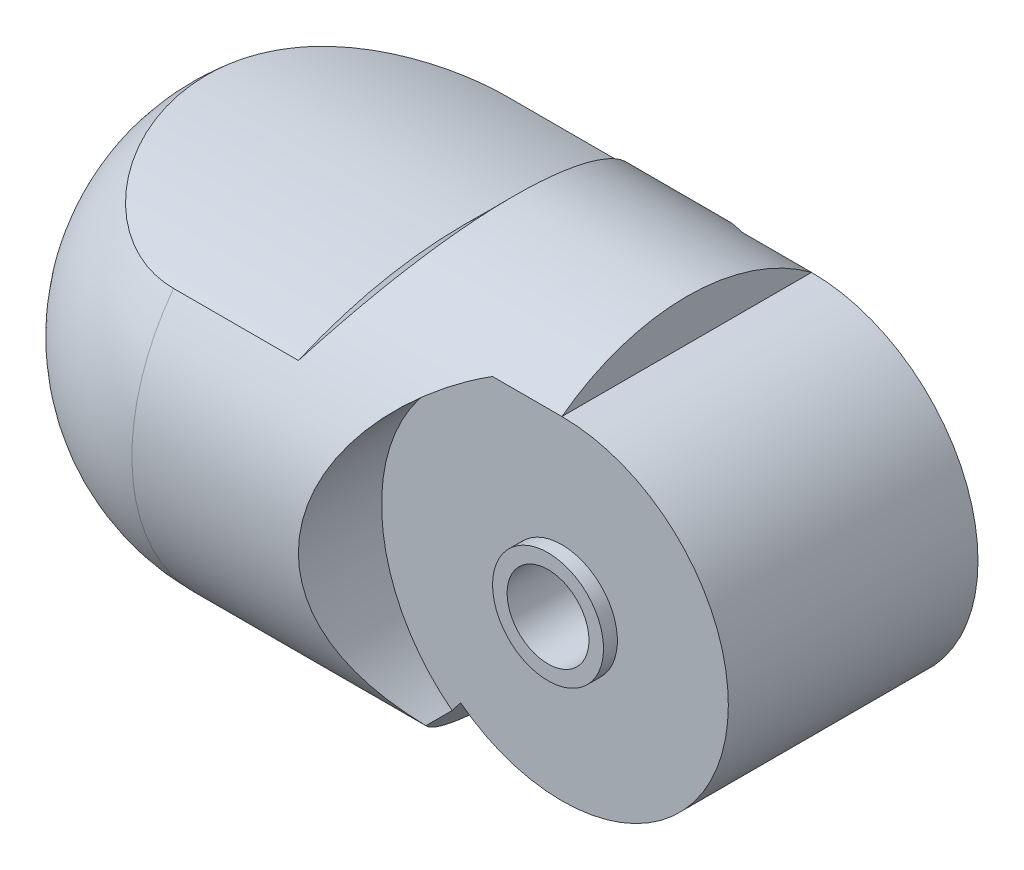
ISO-10303-21;
HEADER;
FILE_DESCRIPTION(('STEP AP214'),'2;1');
FILE_NAME('part.step','',(''),(''),'','','');
FILE_SCHEMA(('AUTOMOTIVE_DESIGN { 1 0 10303 214 1 1 1 1 }'));
ENDSEC;
DATA;
#1=APPLICATION_CONTEXT('core data for automotive mechanical design processes');
#2=APPLICATION_PROTOCOL_DEFINITION('international standard','automotive_design',2000,#1);
#3=PRODUCT_CONTEXT('',#1,'mechanical');
#4=PRODUCT('Part','Part','',(#3));
#5=PRODUCT_RELATED_PRODUCT_CATEGORY('part','',(#4));
#6=PRODUCT_DEFINITION_FORMATION('','',#4);
#7=PRODUCT_DEFINITION_CONTEXT('part definition',#1,'design');
#8=PRODUCT_DEFINITION('design','',#6,#7);
#9=PRODUCT_DEFINITION_SHAPE('','',#8);
#10=(LENGTH_UNIT() NAMED_UNIT(*) SI_UNIT(.MILLI.,.METRE.));
#11=(NAMED_UNIT(*) PLANE_ANGLE_UNIT() SI_UNIT($,.RADIAN.));
#12=(NAMED_UNIT(*) SI_UNIT($,.STERADIAN.) SOLID_ANGLE_UNIT());
#13=UNCERTAINTY_MEASURE_WITH_UNIT(LENGTH_MEASURE(1.E-05),#10,'distance_accuracy_value','');
#14=(GEOMETRIC_REPRESENTATION_CONTEXT(3) GLOBAL_UNCERTAINTY_ASSIGNED_CONTEXT((#13)) GLOBAL_UNIT_ASSIGNED_CONTEXT((#10,
#11,#12)) REPRESENTATION_CONTEXT('',''));
#15=CARTESIAN_POINT('',(0.,0.,0.));
#16=DIRECTION('',(0.,0.,1.));
#17=DIRECTION('',(1.,0.,0.));
#18=AXIS2_PLACEMENT_3D('',#15,#16,#17);
#19=CARTESIAN_POINT('',(-26.6251882186171,0.,0.));
#20=DIRECTION('',(-1.,0.,0.));
#21=DIRECTION('',(0.,-1.,0.));
#22=AXIS2_PLACEMENT_3D('',#19,#20,#21);
#23=CYLINDRICAL_SURFACE('',#22,7.5);
#24=CARTESIAN_POINT('',(-2.5,-6.,-4.5));
#25=CARTESIAN_POINT('',(-2.61366667061248,-5.95262055888465,-4.56319368112157));
#26=CARTESIAN_POINT('',(-2.72516759322645,-5.90238850187312,-4.62807084150607));
#27=CARTESIAN_POINT('',(-2.94400000796077,-5.79635239958535,-4.76019105031561));
#28=CARTESIAN_POINT('',(-3.0513326088171,-5.74054985030666,-4.82743346041018));
#29=CARTESIAN_POINT('',(-3.26215859740532,-5.62342079250245,-4.96338730551682));
#30=CARTESIAN_POINT('',(-3.36564795739226,-5.56208870749052,-5.03210016900114));
#31=CARTESIAN_POINT('',(-3.56876844482203,-5.43399555761649,-5.1701608964219));
#32=CARTESIAN_POINT('',(-3.66839927228238,-5.36723407189021,-5.23950880921422));
#33=CARTESIAN_POINT('',(-3.96339652129213,-5.15752976826969,-5.4487695626039));
#34=CARTESIAN_POINT('',(-4.15295241269161,-5.00623178756896,-5.5886377042216));
#35=CARTESIAN_POINT('',(-4.51583663692844,-4.68149738416788,-5.86334480848415));
#36=CARTESIAN_POINT('',(-4.68917628037558,-4.50807659440667,-5.99818723640243));
#37=CARTESIAN_POINT('',(-4.96228387540287,-4.2014787310822,-6.21449031567108));
#38=CARTESIAN_POINT('',(-5.06707570894892,-4.07458266842885,-6.29855414317088));
#39=CARTESIAN_POINT('',(-5.26815653702774,-3.81103553358688,-6.4614233482491));
#40=CARTESIAN_POINT('',(-5.36444665821888,-3.67438575832695,-6.54022942225285));
#41=CARTESIAN_POINT('',(-5.54728644214343,-3.39201935039931,-6.69101840958885));
#42=CARTESIAN_POINT('',(-5.63387151357495,-3.24633890440872,-6.76302596468398));
#43=CARTESIAN_POINT('',(-5.79667291056018,-2.94580564929915,-6.89923394469671));
#44=CARTESIAN_POINT('',(-5.87289098644523,-2.79095439490396,-6.96343568732871));
#45=CARTESIAN_POINT('',(-6.00088719448196,-2.50190946641496,-7.07175436638536));
#46=CARTESIAN_POINT('',(-6.0545841134301,-2.36913427355743,-7.11739553142938));
#47=CARTESIAN_POINT('',(-6.15365012836646,-2.09841725955915,-7.20185665934003));
#48=CARTESIAN_POINT('',(-6.199020893073,-1.96047648038669,-7.24067798896348));
#49=CARTESIAN_POINT('',(-6.28081706081565,-1.68007906025354,-7.31082898987929));
#50=CARTESIAN_POINT('',(-6.31724149000273,-1.53762192957159,-7.34215784557225));
#51=CARTESIAN_POINT('',(-6.38056734121297,-1.24906981618655,-7.39671419790833));
#52=CARTESIAN_POINT('',(-6.40746863649176,-1.10297478509397,-7.41994158672811));
#53=CARTESIAN_POINT('',(-6.4513861907253,-0.807484063054317,-7.45789923317722));
#54=CARTESIAN_POINT('',(-6.46835477254505,-0.658075968334065,-7.4725885054245));
#55=CARTESIAN_POINT('',(-6.49188983242892,-0.357827461747139,-7.49296996129368));
#56=CARTESIAN_POINT('',(-6.49845629627331,-0.206987047922763,-7.49866213261651));
#57=CARTESIAN_POINT('',(-6.5010598781167,0.0948298715604486,-7.5009185537971));
#58=CARTESIAN_POINT('',(-6.49709858537696,0.245806353239081,-7.49748418139021));
#59=CARTESIAN_POINT('',(-6.47872654463711,0.54663430412716,-7.48156911996084));
#60=CARTESIAN_POINT('',(-6.46431627786198,0.696485824825307,-7.46908884754512));
#61=CARTESIAN_POINT('',(-6.42686844173033,0.982054202030302,-7.43670340679829));
#62=CARTESIAN_POINT('',(-6.40460523515085,1.11794995148203,-7.4174651690957));
#63=CARTESIAN_POINT('',(-6.35178376424087,1.38695318027131,-7.37190467224366));
#64=CARTESIAN_POINT('',(-6.32122273210844,1.52005971325836,-7.34558004940246));
#65=CARTESIAN_POINT('',(-6.25224546498698,1.78265091716036,-7.2863064488754));
#66=CARTESIAN_POINT('',(-6.21383229378641,1.91213697839626,-7.2533600549904));
#67=CARTESIAN_POINT('',(-6.1296255575326,2.16696197731881,-7.18135337236267));
#68=CARTESIAN_POINT('',(-6.08382923655194,2.29229934527282,-7.1422908007759));
#69=CARTESIAN_POINT('',(-5.92884312993451,2.67949014470228,-7.01056690531066));
#70=CARTESIAN_POINT('',(-5.80718040487967,2.93307127107021,-6.90780964574216));
#71=CARTESIAN_POINT('',(-5.53702638274637,3.41586350982597,-6.68229806535853));
#72=CARTESIAN_POINT('',(-5.38850582175061,3.64504760249337,-6.55952194677225));
#73=CARTESIAN_POINT('',(-5.1077269274465,4.02524400009557,-6.3311872103849));
#74=CARTESIAN_POINT('',(-4.98028039114421,4.18172280013087,-6.22868963351702));
#75=CARTESIAN_POINT('',(-4.71373935570052,4.48003113026525,-6.01769835846473));
#76=CARTESIAN_POINT('',(-4.57464403771254,4.62185962895935,-5.90920423893827));
#77=CARTESIAN_POINT('',(-4.28564228596411,4.89104351904513,-5.6884107620547));
#78=CARTESIAN_POINT('',(-4.13572718038339,5.0183870857257,-5.57610839155439));
#79=CARTESIAN_POINT('',(-3.82572924486535,5.25853908861185,-5.35022623803666));
#80=CARTESIAN_POINT('',(-3.66565078501422,5.3713537096887,-5.23664702110163));
#81=CARTESIAN_POINT('',(-3.34302255508886,5.57755412796374,-5.01622928405569));
#82=CARTESIAN_POINT('',(-3.18094445079929,5.67160482759917,-4.90932527564958));
#83=CARTESIAN_POINT('',(-2.93085259782155,5.80249151427385,-4.75244344004898));
#84=CARTESIAN_POINT('',(-2.84647804328824,5.84435855380486,-4.70081479266893));
#85=CARTESIAN_POINT('',(-2.67517596620511,5.92472539490723,-4.59911332702261));
#86=CARTESIAN_POINT('',(-2.58824747093617,5.96322389069861,-4.54904111689938));
#87=CARTESIAN_POINT('',(-2.5,6.,-4.5));
#88=B_SPLINE_CURVE_WITH_KNOTS('',3,(#24,#25,#26,#27,#28,#29,#30,#31,#32,#33,#34,#35,#36,#37,#38,
#39,#40,#41,#42,#43,#44,#45,#46,#47,#48,#49,#50,#51,#52,#53,#54,#55,#56,#57,#58,#59,#60,#61,#62,
#63,#64,#65,#66,#67,#68,#69,#70,#71,#72,#73,#74,#75,#76,#77,#78,#79,#80,#81,#82,#83,#84,#85,#86,
#87),.UNSPECIFIED.,.F.,.F.,(4,2,2,2,2,2,2,2,2,2,2,2,2,2,2,2,2,2,2,2,2,2,2,2,2,2,2,2,2,2,2,4),
(0.,0.415135864992279,0.830160540540041,1.24560854930786,1.66108879259882,2.49960373279301,
3.33752939050435,3.89146392016444,4.44532493114681,4.99709446165422,5.54877071716296,
5.99929133607163,6.44972156330621,6.90020080019757,7.3506860323385,7.8033162335454,
8.25594705349888,8.70850954856689,9.16105120230198,9.57772293841711,9.99453382961873,
10.4111823967565,10.8279868490139,11.7227590587879,12.6185121391885,13.2967009311582,
13.9749374362249,14.6537237022159,15.332220051707,15.9787535245467,16.300908349358,
16.6231875058518),.UNSPECIFIED.);
#89=CARTESIAN_POINT('',(-3.95694928855665,-5.15679671189305,-5.44586519041824));
#90=VERTEX_POINT('',#89);
#91=CARTESIAN_POINT('',(-2.5,6.,-4.5));
#92=VERTEX_POINT('',#91);
#93=EDGE_CURVE('E115',#90,#92,#88,.T.);
#94=ORIENTED_EDGE('',*,*,#93,.F.);
#95=CARTESIAN_POINT('',(0.,0.,0.));
#96=DIRECTION('',(-0.793353340291238,0.608761429008716,0.));
#97=DIRECTION('',(-0.608761429008716,-0.793353340291239,0.));
#98=AXIS2_PLACEMENT_3D('',#95,#96,#97);
#99=ELLIPSE('',#98,9.45354310507695,7.5);
#100=CARTESIAN_POINT('',(-3.95694928855665,-5.15679671189305,5.44586519041824));
#101=VERTEX_POINT('',#100);
#102=EDGE_CURVE('E198',#101,#90,#99,.F.);
#103=ORIENTED_EDGE('',*,*,#102,.F.);
#104=CARTESIAN_POINT('',(-2.5,-6.,4.5));
#105=CARTESIAN_POINT('',(-2.61367522101961,-5.95261699088738,4.56319844444583));
#106=CARTESIAN_POINT('',(-2.72518437160695,-5.90238094023967,4.62808061085044));
#107=CARTESIAN_POINT('',(-2.94403263423304,-5.79633601977337,4.76021111439956));
#108=CARTESIAN_POINT('',(-3.05137285506923,-5.74052864603781,4.82745881319642));
#109=CARTESIAN_POINT('',(-3.26221366242599,-5.62338904407964,4.96342341331666));
#110=CARTESIAN_POINT('',(-3.36571021523305,-5.56205123108881,5.03214174510302));
#111=CARTESIAN_POINT('',(-3.56884451127557,-5.43394580190881,5.17021333902797));
#112=CARTESIAN_POINT('',(-3.66848195464748,-5.36717776502068,5.23956664999059));
#113=CARTESIAN_POINT('',(-3.96346857465463,-5.15747355467889,5.44882232451689));
#114=CARTESIAN_POINT('',(-4.15300863426054,-5.00618427872872,5.58867970324437));
#115=CARTESIAN_POINT('',(-4.51586309061732,-4.68147091278737,5.86336539213265));
#116=CARTESIAN_POINT('',(-4.68918883242538,-4.50806250327414,5.99819717832596));
#117=CARTESIAN_POINT('',(-4.96226219080438,-4.20150307470233,6.21447314091494));
#118=CARTESIAN_POINT('',(-5.06703389007009,-4.07463330422973,6.29852059718943));
#119=CARTESIAN_POINT('',(-5.26807866124039,-3.81114177232305,6.46135994500837));
#120=CARTESIAN_POINT('',(-5.36435280229892,-3.67452124164276,6.54015249741361));
#121=CARTESIAN_POINT('',(-5.54720140321441,-3.39216009771402,6.69094780167801));
#122=CARTESIAN_POINT('',(-5.63380750852531,-3.24645182720998,6.7629725755263));
#123=CARTESIAN_POINT('',(-5.79664479191743,-2.94586278159998,6.8992102585551));
#124=CARTESIAN_POINT('',(-5.87287797917142,-2.79098379117285,6.9634246802981));
#125=CARTESIAN_POINT('',(-6.0009332075686,-2.50180553959393,7.07179330517556));
#126=CARTESIAN_POINT('',(-6.05467000827909,-2.36892181732247,7.11746853803065));
#127=CARTESIAN_POINT('',(-6.15380197092644,-2.09798001017353,7.2019863422126));
#128=CARTESIAN_POINT('',(-6.19919880060703,-1.95992296646749,7.24083027952689));
#129=CARTESIAN_POINT('',(-6.28097417699106,-1.67948392098147,7.31096402736799));
#130=CARTESIAN_POINT('',(-6.31736435949611,-1.53710776904545,7.34226358319621));
#131=CARTESIAN_POINT('',(-6.38062065233832,-1.24878107355619,7.39676024339439));
#132=CARTESIAN_POINT('',(-6.40749027012771,-1.10283186757419,7.41996033162659));
#133=CARTESIAN_POINT('',(-6.45274600790494,-0.79833197820178,7.45907446372095));
#134=CARTESIAN_POINT('',(-6.4704323472663,-0.639598463539314,7.47438693407364));
#135=CARTESIAN_POINT('',(-6.49406018337431,-0.320575178956093,7.49485040713795));
#136=CARTESIAN_POINT('',(-6.49999964923658,-0.160285144745908,7.49999965275752));
#137=CARTESIAN_POINT('',(-6.50000033364919,0.152464609968258,7.50000033030004));
#138=CARTESIAN_POINT('',(-6.49462696888949,0.304924795959886,7.49534194856033));
#139=CARTESIAN_POINT('',(-6.4732367117178,0.608591249224011,7.47681515851016));
#140=CARTESIAN_POINT('',(-6.45721557705085,0.759796992383952,7.4629430793053));
#141=CARTESIAN_POINT('',(-6.41480725603112,1.0598261065879,7.42628026563808));
#142=CARTESIAN_POINT('',(-6.38840785052468,1.20864645336881,7.40347901828702));
#143=CARTESIAN_POINT('',(-6.32570681363501,1.50267947985689,7.34944312255976));
#144=CARTESIAN_POINT('',(-6.28940081246036,1.64789053659561,7.31820475263756));
#145=CARTESIAN_POINT('',(-6.20777395473506,1.93269936103721,7.24817356023754));
#146=CARTESIAN_POINT('',(-6.16251910820489,2.0723297279218,7.20943609542606));
#147=CARTESIAN_POINT('',(-6.06348031592944,2.34637348770517,7.12496524970025));
#148=CARTESIAN_POINT('',(-6.00969263500692,2.48078456367899,7.07922880535239));
#149=CARTESIAN_POINT('',(-5.83653843690031,2.87526626468125,6.93263082599652));
#150=CARTESIAN_POINT('',(-5.70531817210403,3.12679884369847,6.82232646953341));
#151=CARTESIAN_POINT('',(-5.46108401227987,3.53043059611895,6.61969374138968));
#152=CARTESIAN_POINT('',(-5.35488343220022,3.68931795831053,6.53227097396106));
#153=CARTESIAN_POINT('',(-5.13116816968434,3.99460823713841,6.350169718351));
#154=CARTESIAN_POINT('',(-5.01364953887934,4.14100676313852,6.25548870045324));
#155=CARTESIAN_POINT('',(-4.76820483770715,4.42143011154753,6.06054454878114));
#156=CARTESIAN_POINT('',(-4.64025653253738,4.55542712532428,5.96026964106493));
#157=CARTESIAN_POINT('',(-4.37497865755507,4.81076390776239,5.75614898984128));
#158=CARTESIAN_POINT('',(-4.23765009721239,4.93210503486512,5.6523036311686));
#159=CARTESIAN_POINT('',(-3.97540220932641,5.14492452434527,5.45868292304525));
#160=CARTESIAN_POINT('',(-3.85172180190743,5.2381497491077,5.36913977443785));
#161=CARTESIAN_POINT('',(-3.59801615175632,5.41555404117384,5.19014976634271));
#162=CARTESIAN_POINT('',(-3.46799224541517,5.49973500197725,5.10070289059667));
#163=CARTESIAN_POINT('',(-3.20226875178359,5.65856318933959,4.92388600611484));
#164=CARTESIAN_POINT('',(-3.06660754527622,5.73326417003545,4.83650680563881));
#165=CARTESIAN_POINT('',(-2.78848268180326,5.87354065753758,4.66518156088281));
#166=CARTESIAN_POINT('',(-2.64601611051737,5.93911220685187,4.58123701654736));
#167=CARTESIAN_POINT('',(-2.5,6.,4.5));
#168=B_SPLINE_CURVE_WITH_KNOTS('',3,(#104,#105,#106,#107,#108,#109,#110,#111,#112,#113,#114,
#115,#116,#117,#118,#119,#120,#121,#122,#123,#124,#125,#126,#127,#128,#129,#130,#131,#132,#133,
#134,#135,#136,#137,#138,#139,#140,#141,#142,#143,#144,#145,#146,#147,#148,#149,#150,#151,#152,
#153,#154,#155,#156,#157,#158,#159,#160,#161,#162,#163,#164,#165,#166,#167),.UNSPECIFIED.,.F.,
.F.,(4,2,2,2,2,2,2,2,2,2,2,2,2,2,2,2,2,2,2,2,2,2,2,2,2,2,2,2,2,2,2,4),(0.,0.415167094265802,
0.830223000905574,1.24570283823242,1.66121489499363,2.4996677598009,3.3375295063532,
3.89135356195819,4.44510783637,4.99699284422855,5.54877080259767,5.99965158251598,
6.45044210144477,6.90064716227692,7.35068619108759,7.8312780910662,8.31195307198487,
8.7691752531386,9.22657970877654,9.68452432330484,10.1426712642933,10.5975569806374,
11.0526423716779,11.9621335877428,12.5918969223417,13.2218807549321,13.8532446431907,
14.4845406930273,15.0209144027754,15.5571755980377,16.0902454964702,16.6235457591892),.UNSPECIFIED.);
#169=CARTESIAN_POINT('',(-2.5,6.,4.5));
#170=VERTEX_POINT('',#169);
#171=EDGE_CURVE('E170',#101,#170,#168,.T.);
#172=ORIENTED_EDGE('',*,*,#171,.T.);
#173=DIRECTION('',(-1.,0.,0.));
#174=VECTOR('',#173,1.);
#175=CARTESIAN_POINT('',(-26.6251882186171,6.,4.5));
#176=LINE('',#175,#174);
#177=CARTESIAN_POINT('',(0.,6.,4.5));
#178=VERTEX_POINT('',#177);
#179=EDGE_CURVE('E174',#170,#178,#176,.F.);
#180=ORIENTED_EDGE('',*,*,#179,.T.);
#181=CARTESIAN_POINT('',(0.,0.,0.));
#182=DIRECTION('',(-1.,0.,0.));
#183=DIRECTION('',(0.,-1.,0.));
#184=AXIS2_PLACEMENT_3D('',#181,#182,#183);
#185=CIRCLE('',#184,7.5);
#186=CARTESIAN_POINT('',(0.,6.,-4.5));
#187=VERTEX_POINT('',#186);
#188=EDGE_CURVE('E134',#178,#187,#185,.T.);
#189=ORIENTED_EDGE('',*,*,#188,.T.);
#190=DIRECTION('',(-1.,0.,0.));
#191=VECTOR('',#190,1.);
#192=CARTESIAN_POINT('',(-26.6251882186171,6.,-4.5));
#193=LINE('',#192,#191);
#194=EDGE_CURVE('E125',#92,#187,#193,.F.);
#195=ORIENTED_EDGE('',*,*,#194,.F.);
#196=EDGE_LOOP('',(#94,#103,#172,#180,#189,#195));
#197=FACE_BOUND('',#196,.T.);
#198=CARTESIAN_POINT('',(-12.5,0.,0.));
#199=DIRECTION('',(-1.,0.,0.));
#200=DIRECTION('',(0.,-1.,0.));
#201=AXIS2_PLACEMENT_3D('',#198,#199,#200);
#202=CIRCLE('',#201,7.5);
#203=CARTESIAN_POINT('',(-12.5,4.5,-6.));
#204=VERTEX_POINT('',#203);
#205=CARTESIAN_POINT('',(-12.5,4.5,6.));
#206=VERTEX_POINT('',#205);
#207=EDGE_CURVE('E195',#204,#206,#202,.T.);
#208=ORIENTED_EDGE('',*,*,#207,.F.);
#209=DIRECTION('',(1.,0.,0.));
#210=VECTOR('',#209,1.);
#211=CARTESIAN_POINT('',(-20.,4.5,-6.));
#212=LINE('',#211,#210);
#213=CARTESIAN_POINT('',(-8.00000000000004,4.5,-6.));
#214=VERTEX_POINT('',#213);
#215=EDGE_CURVE('E176',#204,#214,#212,.T.);
#216=ORIENTED_EDGE('',*,*,#215,.T.);
#217=CARTESIAN_POINT('',(-8.00000000000004,4.5,-6.));
#218=CARTESIAN_POINT('',(-7.90462281361367,4.65470037768084,-5.88399773688748));
#219=CARTESIAN_POINT('',(-7.81219526066145,4.80609880375609,-5.76107821624634));
#220=CARTESIAN_POINT('',(-7.63368841616847,5.10098960928757,-5.5016745160501));
#221=CARTESIAN_POINT('',(-7.54761306848754,5.24447706335078,-5.36518203092222));
#222=CARTESIAN_POINT('',(-7.38193297801115,5.52279796603769,-5.07827475923196));
#223=CARTESIAN_POINT('',(-7.30236561610647,5.65758059591276,-4.92778889069743));
#224=CARTESIAN_POINT('',(-7.15076788989482,5.9161541369522,-4.61415348692818));
#225=CARTESIAN_POINT('',(-7.07873597621666,6.03994730687494,-4.45100656700884));
#226=CARTESIAN_POINT('',(-6.9424280863894,6.2756227430557,-4.11209655560521));
#227=CARTESIAN_POINT('',(-6.87818658574533,6.38745182401709,-3.93628250832379));
#228=CARTESIAN_POINT('',(-6.75834812267142,6.59714580549484,-3.57372577401076));
#229=CARTESIAN_POINT('',(-6.70275036063513,6.69501199760735,-3.38698410006365));
#230=CARTESIAN_POINT('',(-6.6008559177083,6.87514239916047,-3.00448757813093));
#231=CARTESIAN_POINT('',(-6.5545285565267,6.95745802069553,-2.80876518745344));
#232=CARTESIAN_POINT('',(-6.47139883504046,7.10566350819068,-2.40933914866201));
#233=CARTESIAN_POINT('',(-6.43459266665583,7.17155994075227,-2.20563872907722));
#234=CARTESIAN_POINT('',(-6.36404391670424,7.29817549344354,-1.74769399382004));
#235=CARTESIAN_POINT('',(-6.33263069126811,7.35478985625956,-1.491938971975));
#236=CARTESIAN_POINT('',(-6.28483175126848,7.44106170301313,-0.97438960123838));
#237=CARTESIAN_POINT('',(-6.26845293949601,7.47070680442505,-0.712592534739189));
#238=CARTESIAN_POINT('',(-6.25347774863572,7.49781675062912,-0.26148936296499));
#239=CARTESIAN_POINT('',(-6.25115603592252,7.50202280719895,-0.0726770085563871));
#240=CARTESIAN_POINT('',(-6.25438090901204,7.49618230064462,0.304719108490814));
#241=CARTESIAN_POINT('',(-6.25992915202738,7.48613273564887,0.49330281461191));
#242=CARTESIAN_POINT('',(-6.27885846249224,7.45188674483738,0.868891747047117));
#243=CARTESIAN_POINT('',(-6.29224422131285,7.42768184594869,1.05589595984196));
#244=CARTESIAN_POINT('',(-6.32674106332078,7.36542119064468,1.42686511378018));
#245=CARTESIAN_POINT('',(-6.34785241121845,7.32736495962616,1.6108299505563));
#246=CARTESIAN_POINT('',(-6.39757733602606,7.23796046574324,1.97404039570457));
#247=CARTESIAN_POINT('',(-6.42617501155002,7.18664037896568,2.15329513103093));
#248=CARTESIAN_POINT('',(-6.4906719783472,7.07127357397338,2.50630675224607));
#249=CARTESIAN_POINT('',(-6.52657137565384,7.00722667094395,2.68006355825324));
#250=CARTESIAN_POINT('',(-6.60540374020179,6.86713483785824,3.02099710823956));
#251=CARTESIAN_POINT('',(-6.64833620884355,6.79109075833876,3.18817431762858));
#252=CARTESIAN_POINT('',(-6.74095250908429,6.62779208777641,3.51507736851775));
#253=CARTESIAN_POINT('',(-6.79063861232337,6.54053372525849,3.67480067845063));
#254=CARTESIAN_POINT('',(-6.89813740543756,6.35272542467053,3.99096103446995));
#255=CARTESIAN_POINT('',(-6.95616073365386,6.25183722533701,4.14712533355544));
#256=CARTESIAN_POINT('',(-7.07867647510121,6.04009686708339,4.44987159957897));
#257=CARTESIAN_POINT('',(-7.14316940018904,5.92924391985192,4.59645280681124));
#258=CARTESIAN_POINT('',(-7.27820573312618,5.69868691053789,4.8793703557296));
#259=CARTESIAN_POINT('',(-7.34874629551549,5.57898701462949,5.01571145942592));
#260=CARTESIAN_POINT('',(-7.49550548566534,5.33177025645502,5.27775130953556));
#261=CARTESIAN_POINT('',(-7.57172240602367,5.20425574678891,5.40345323201729));
#262=CARTESIAN_POINT('',(-7.70632231741607,4.98084629630909,5.60864968171442));
#263=CARTESIAN_POINT('',(-7.76337842951352,4.88664839361514,5.69088230082653));
#264=CARTESIAN_POINT('',(-7.87989384155583,4.69541134519173,5.84966063338628));
#265=CARTESIAN_POINT('',(-7.93934779283758,4.59837864316327,5.92621802838532));
#266=CARTESIAN_POINT('',(-8.00000000000004,4.5,6.));
#267=B_SPLINE_CURVE_WITH_KNOTS('',3,(#217,#218,#219,#220,#221,#222,#223,#224,#225,#226,#227,
#228,#229,#230,#231,#232,#233,#234,#235,#236,#237,#238,#239,#240,#241,#242,#243,#244,#245,#246,
#247,#248,#249,#250,#251,#252,#253,#254,#255,#256,#257,#258,#259,#260,#261,#262,#263,#264,#265,
#266),.UNSPECIFIED.,.F.,.F.,(4,2,2,2,2,2,2,2,2,2,2,2,2,2,2,2,2,2,2,2,2,2,2,2,4),(0.,
0.646731123311507,1.29386045871569,1.94447814144082,2.59496178598064,3.24822643798491,
3.90143062242196,4.55243591872879,5.20318043608798,5.99277476635689,6.78273144413987,
7.34869672691958,7.91478120529614,8.48120487677203,9.04764795806361,9.61289750895877,
10.1781552688244,10.743372972877,11.3087812651519,11.8924507052558,12.4761663601624,
13.0596088639803,13.6428765763696,14.0550497726622,14.4663495557302),.UNSPECIFIED.);
#268=CARTESIAN_POINT('',(-8.00000000000004,4.5,6.));
#269=VERTEX_POINT('',#268);
#270=EDGE_CURVE('E71',#214,#269,#267,.T.);
#271=ORIENTED_EDGE('',*,*,#270,.T.);
#272=DIRECTION('',(1.,0.,0.));
#273=VECTOR('',#272,1.);
#274=CARTESIAN_POINT('',(-20.,4.5,6.));
#275=LINE('',#274,#273);
#276=EDGE_CURVE('E172',#206,#269,#275,.T.);
#277=ORIENTED_EDGE('',*,*,#276,.F.);
#278=EDGE_LOOP('',(#208,#216,#271,#277));
#279=FACE_BOUND('',#278,.T.);
#280=ADVANCED_FACE('F47',(#197,#279),#23,.T.);
#281=CARTESIAN_POINT('',(-3.6525685740523,-4.76012004174743,-7.5));
#282=DIRECTION('',(-0.793353340291238,0.608761429008716,0.));
#283=DIRECTION('',(-0.608761429008716,-0.793353340291239,0.));
#284=AXIS2_PLACEMENT_3D('',#281,#282,#283);
#285=PLANE('',#284);
#286=ORIENTED_EDGE('',*,*,#102,.T.);
#287=DIRECTION('',(0.,0.,1.));
#288=VECTOR('',#287,1.);
#289=CARTESIAN_POINT('',(-3.95694928855665,-5.15679671189305,-7.5));
#290=LINE('',#289,#288);
#291=CARTESIAN_POINT('',(-3.95694928855665,-5.15679671189305,-4.5));
#292=VERTEX_POINT('',#291);
#293=EDGE_CURVE('E58',#90,#292,#290,.T.);
#294=ORIENTED_EDGE('',*,*,#293,.T.);
#295=DIRECTION('',(0.608761429008716,0.793353340291239,0.));
#296=VECTOR('',#295,1.);
#297=CARTESIAN_POINT('',(-3.6525685740523,-4.76012004174743,-4.5));
#298=LINE('',#297,#296);
#299=CARTESIAN_POINT('',(-3.6525685740523,-4.76012004174743,-4.5));
#300=VERTEX_POINT('',#299);
#301=EDGE_CURVE('E130',#292,#300,#298,.T.);
#302=ORIENTED_EDGE('',*,*,#301,.T.);
#303=DIRECTION('',(0.,0.,1.));
#304=VECTOR('',#303,1.);
#305=CARTESIAN_POINT('',(-3.6525685740523,-4.76012004174743,-7.5));
#306=LINE('',#305,#304);
#307=CARTESIAN_POINT('',(-3.6525685740523,-4.76012004174743,4.5));
#308=VERTEX_POINT('',#307);
#309=EDGE_CURVE('E183',#300,#308,#306,.T.);
#310=ORIENTED_EDGE('',*,*,#309,.T.);
#311=DIRECTION('',(0.608761429008716,0.793353340291239,0.));
#312=VECTOR('',#311,1.);
#313=CARTESIAN_POINT('',(-3.6525685740523,-4.76012004174743,4.5));
#314=LINE('',#313,#312);
#315=CARTESIAN_POINT('',(-3.95694928855665,-5.15679671189305,4.5));
#316=VERTEX_POINT('',#315);
#317=EDGE_CURVE('E239',#316,#308,#314,.T.);
#318=ORIENTED_EDGE('',*,*,#317,.F.);
#319=DIRECTION('',(0.,0.,-1.));
#320=VECTOR('',#319,1.);
#321=CARTESIAN_POINT('',(-3.95694928855665,-5.15679671189305,7.5));
#322=LINE('',#321,#320);
#323=EDGE_CURVE('E231',#101,#316,#322,.T.);
#324=ORIENTED_EDGE('',*,*,#323,.F.);
#325=EDGE_LOOP('',(#286,#294,#302,#310,#318,#324));
#326=FACE_BOUND('',#325,.T.);
#327=ADVANCED_FACE('F222',(#326),#285,.F.);
#328=CARTESIAN_POINT('',(0.,0.,4.5));
#329=DIRECTION('',(0.,0.,-1.));
#330=DIRECTION('',(-1.,0.,0.));
#331=AXIS2_PLACEMENT_3D('',#328,#329,#330);
#332=CYLINDRICAL_SURFACE('',#331,6.);
#333=ORIENTED_EDGE('',*,*,#309,.F.);
#334=CARTESIAN_POINT('',(0.,0.,-4.5));
#335=DIRECTION('',(0.,0.,1.));
#336=DIRECTION('',(1.,0.,0.));
#337=AXIS2_PLACEMENT_3D('',#334,#335,#336);
#338=CIRCLE('',#337,6.);
#339=EDGE_CURVE('E204',#300,#187,#338,.T.);
#340=ORIENTED_EDGE('',*,*,#339,.T.);
#341=DIRECTION('',(0.,0.,1.));
#342=VECTOR('',#341,1.);
#343=CARTESIAN_POINT('',(0.,6.,-7.5));
#344=LINE('',#343,#342);
#345=EDGE_CURVE('E179',#187,#178,#344,.T.);
#346=ORIENTED_EDGE('',*,*,#345,.T.);
#347=CARTESIAN_POINT('',(0.,0.,4.5));
#348=DIRECTION('',(0.,0.,1.));
#349=DIRECTION('',(1.,0.,0.));
#350=AXIS2_PLACEMENT_3D('',#347,#348,#349);
#351=CIRCLE('',#350,6.);
#352=EDGE_CURVE('E186',#308,#178,#351,.T.);
#353=ORIENTED_EDGE('',*,*,#352,.F.);
#354=EDGE_LOOP('',(#333,#340,#346,#353));
#355=FACE_BOUND('',#354,.T.);
#356=ADVANCED_FACE('F225',(#355),#332,.T.);
#357=CARTESIAN_POINT('',(0.,0.,4.5));
#358=DIRECTION('',(0.,0.,1.));
#359=DIRECTION('',(1.,0.,0.));
#360=AXIS2_PLACEMENT_3D('',#357,#358,#359);
#361=PLANE('',#360);
#362=CARTESIAN_POINT('',(0.,0.,4.5));
#363=DIRECTION('',(0.,0.,-1.));
#364=DIRECTION('',(-1.,0.,0.));
#365=AXIS2_PLACEMENT_3D('',#362,#363,#364);
#366=CIRCLE('',#365,2.);
#367=CARTESIAN_POINT('',(-2.,0.,4.5));
#368=VERTEX_POINT('',#367);
#369=EDGE_CURVE('E266',#368,#368,#366,.T.);
#370=ORIENTED_EDGE('',*,*,#369,.T.);
#371=EDGE_LOOP('',(#370));
#372=FACE_BOUND('',#371,.T.);
#373=ORIENTED_EDGE('',*,*,#352,.T.);
#374=ORIENTED_EDGE('',*,*,#179,.F.);
#375=CARTESIAN_POINT('',(0.,0.,4.5));
#376=DIRECTION('',(0.,0.,1.));
#377=DIRECTION('',(1.,0.,0.));
#378=AXIS2_PLACEMENT_3D('',#375,#376,#377);
#379=CIRCLE('',#378,6.5);
#380=EDGE_CURVE('E70',#170,#316,#379,.T.);
#381=ORIENTED_EDGE('',*,*,#380,.T.);
#382=ORIENTED_EDGE('',*,*,#317,.T.);
#383=EDGE_LOOP('',(#373,#374,#381,#382));
#384=FACE_BOUND('',#383,.T.);
#385=ADVANCED_FACE('F230',(#372,#384),#361,.T.);
#386=CARTESIAN_POINT('',(0.,0.,-4.5));
#387=DIRECTION('',(0.,0.,1.));
#388=DIRECTION('',(1.,0.,0.));
#389=AXIS2_PLACEMENT_3D('',#386,#387,#388);
#390=PLANE('',#389);
#391=CARTESIAN_POINT('',(0.,0.,-4.5));
#392=DIRECTION('',(0.,0.,1.));
#393=DIRECTION('',(1.,0.,0.));
#394=AXIS2_PLACEMENT_3D('',#391,#392,#393);
#395=CIRCLE('',#394,2.);
#396=CARTESIAN_POINT('',(2.,0.,-4.5));
#397=VERTEX_POINT('',#396);
#398=EDGE_CURVE('E11',#397,#397,#395,.F.);
#399=ORIENTED_EDGE('',*,*,#398,.F.);
#400=EDGE_LOOP('',(#399));
#401=FACE_BOUND('',#400,.T.);
#402=ORIENTED_EDGE('',*,*,#339,.F.);
#403=ORIENTED_EDGE('',*,*,#301,.F.);
#404=CARTESIAN_POINT('',(0.,0.,-4.5));
#405=DIRECTION('',(0.,0.,1.));
#406=DIRECTION('',(1.,0.,0.));
#407=AXIS2_PLACEMENT_3D('',#404,#405,#406);
#408=CIRCLE('',#407,6.5);
#409=EDGE_CURVE('E114',#92,#292,#408,.T.);
#410=ORIENTED_EDGE('',*,*,#409,.F.);
#411=ORIENTED_EDGE('',*,*,#194,.T.);
#412=EDGE_LOOP('',(#402,#403,#410,#411));
#413=FACE_BOUND('',#412,.T.);
#414=ADVANCED_FACE('F129',(#401,#413),#390,.F.);
#415=CARTESIAN_POINT('',(0.,0.,0.));
#416=DIRECTION('',(1.,0.,0.));
#417=DIRECTION('',(0.,1.,0.));
#418=AXIS2_PLACEMENT_3D('',#415,#416,#417);
#419=PLANE('',#418);
#420=ORIENTED_EDGE('',*,*,#345,.F.);
#421=ORIENTED_EDGE('',*,*,#188,.F.);
#422=EDGE_LOOP('',(#420,#421));
#423=FACE_BOUND('',#422,.T.);
#424=ADVANCED_FACE('F218',(#423),#419,.T.);
#425=CARTESIAN_POINT('',(-12.5,0.,0.));
#426=DIRECTION('',(-1.,0.,0.));
#427=DIRECTION('',(0.,1.,0.));
#428=AXIS2_PLACEMENT_3D('',#425,#426,#427);
#429=SPHERICAL_SURFACE('',#428,7.5);
#430=CARTESIAN_POINT('',(-12.4998,4.50000000216269,-5.99999999504466));
#431=CARTESIAN_POINT('',(-12.6255870807863,4.49996189065697,-6.00004562392007));
#432=CARTESIAN_POINT('',(-12.7513463654693,4.50255995539478,-5.99413356787414));
#433=CARTESIAN_POINT('',(-13.0014640864266,4.51276065385299,-5.97070119164442));
#434=CARTESIAN_POINT('',(-13.1258236776686,4.52035879811585,-5.95319128481483));
#435=CARTESIAN_POINT('',(-13.3708693141682,4.54019903889874,-5.90708708815846));
#436=CARTESIAN_POINT('',(-13.4915789053878,4.55239679998597,-5.87859856471982));
#437=CARTESIAN_POINT('',(-13.7294800561217,4.58096307478044,-5.81108211934314));
#438=CARTESIAN_POINT('',(-13.8466710653247,4.59733223714167,-5.7720525582145));
#439=CARTESIAN_POINT('',(-14.1908462739512,4.65174686088364,-5.64035845139919));
#440=CARTESIAN_POINT('',(-14.4114792648582,4.69519195799304,-5.53288445821469));
#441=CARTESIAN_POINT('',(-14.830814897854,4.79133456926281,-5.28417410808728));
#442=CARTESIAN_POINT('',(-15.0294611010074,4.84405503475214,-5.14285367930019));
#443=CARTESIAN_POINT('',(-15.4453459994383,4.9661885084267,-4.79640442678384));
#444=CARTESIAN_POINT('',(-15.6562773266649,5.03664403906322,-4.58407690938894));
#445=CARTESIAN_POINT('',(-16.0396343550452,5.17541684595394,-4.12675424849189));
#446=CARTESIAN_POINT('',(-16.2120354635939,5.24373273276202,-3.88173839947097));
#447=CARTESIAN_POINT('',(-16.5205003341981,5.37266734589988,-3.3639467448782));
#448=CARTESIAN_POINT('',(-16.656102218858,5.43318363731701,-3.09087255986724));
#449=CARTESIAN_POINT('',(-16.8889897439252,5.54077698994774,-2.52638580404564));
#450=CARTESIAN_POINT('',(-16.9862759826398,5.58785426101142,-2.23497351967085));
#451=CARTESIAN_POINT('',(-17.1105361915374,5.64920337331132,-1.76416002639168));
#452=CARTESIAN_POINT('',(-17.1499223512156,5.66897422377925,-1.58861426689425));
#453=CARTESIAN_POINT('',(-17.2160143969336,5.7024401345783,-1.23453367749533));
#454=CARTESIAN_POINT('',(-17.2427190848101,5.71613462079789,-1.05599856680481));
#455=CARTESIAN_POINT('',(-17.2835163132087,5.73714822459152,-0.697041998454035));
#456=CARTESIAN_POINT('',(-17.2976025867417,5.7444641741901,-0.516619648439835));
#457=CARTESIAN_POINT('',(-17.3131844436937,5.75256094602659,-0.155084186418221));
#458=CARTESIAN_POINT('',(-17.3146798054692,5.75334165322177,0.0260289376930439));
#459=CARTESIAN_POINT('',(-17.3047631895669,5.74818336976665,0.399861694173582));
#460=CARTESIAN_POINT('',(-17.2924869955835,5.74179444920076,0.59255293088115));
#461=CARTESIAN_POINT('',(-17.2535765743187,5.72171168703215,0.976108085996819));
#462=CARTESIAN_POINT('',(-17.2269414645824,5.70801739646435,1.16697189136279));
#463=CARTESIAN_POINT('',(-17.1592074968362,5.67364329474787,1.54559287174308));
#464=CARTESIAN_POINT('',(-17.1181006602298,5.65295963044935,1.73334827311456));
#465=CARTESIAN_POINT('',(-17.0212981824738,5.60512525998405,2.10421780386663));
#466=CARTESIAN_POINT('',(-16.9656031156862,5.57797480842885,2.28733211566312));
#467=CARTESIAN_POINT('',(-16.8397298380743,5.5180507242932,2.64666521602244));
#468=CARTESIAN_POINT('',(-16.7696154203222,5.48530196354788,2.82291044207765));
#469=CARTESIAN_POINT('',(-16.6145631003826,5.41501496888091,3.1678024796136));
#470=CARTESIAN_POINT('',(-16.52962348903,5.37747618286175,3.3364484121643));
#471=CARTESIAN_POINT('',(-16.3448431770683,5.29880666743071,3.6642486466255));
#472=CARTESIAN_POINT('',(-16.2450204520386,5.2576802955715,3.82341407877299));
#473=CARTESIAN_POINT('',(-16.0303396108816,5.17323520258443,4.13052443067913));
#474=CARTESIAN_POINT('',(-15.9154879107758,5.12991742180453,4.27847409623458));
#475=CARTESIAN_POINT('',(-15.6204126458882,5.02483771823575,4.61922768208386));
#476=CARTESIAN_POINT('',(-15.4326852775157,4.96279072535492,4.80557251594877));
#477=CARTESIAN_POINT('',(-15.0281843393904,4.84338294878197,5.14519937275995));
#478=CARTESIAN_POINT('',(-14.811449072977,4.78601614325484,5.29852431172811));
#479=CARTESIAN_POINT('',(-14.3886585740065,4.69084569134475,5.5435248051484));
#480=CARTESIAN_POINT('',(-14.1864282694928,4.65138083546961,5.6411359793808));
#481=CARTESIAN_POINT('',(-13.7673593654878,4.58448416265992,5.80324853531095));
#482=CARTESIAN_POINT('',(-13.5505479747695,4.5570306136603,5.86780975062805));
#483=CARTESIAN_POINT('',(-13.1934431367578,4.52499753267483,5.94247563028262));
#484=CARTESIAN_POINT('',(-13.055868618684,4.51568001751423,5.96397864042429));
#485=CARTESIAN_POINT('',(-12.7788301041966,4.50315492301111,5.99277235691834));
#486=CARTESIAN_POINT('',(-12.6393643335659,4.49995354773263,6.00004863219073));
#487=CARTESIAN_POINT('',(-12.4998,4.50000000216269,5.99999999504465));
#488=B_SPLINE_CURVE_WITH_KNOTS('',3,(#430,#431,#432,#433,#434,#435,#436,#437,#438,#439,#440,
#441,#442,#443,#444,#445,#446,#447,#448,#449,#450,#451,#452,#453,#454,#455,#456,#457,#458,#459,
#460,#461,#462,#463,#464,#465,#466,#467,#468,#469,#470,#471,#472,#473,#474,#475,#476,#477,#478,
#479,#480,#481,#482,#483,#484,#485,#486,#487),.UNSPECIFIED.,.F.,.F.,(4,2,2,2,2,2,2,2,2,2,2,2,2,
2,2,2,2,2,2,2,2,2,2,2,2,2,2,2,4),(0.,0.377149568787254,0.753960964759031,1.12722947482292,
1.50055606369257,2.24404792500995,2.98940607192548,3.90696510627765,4.82510812717604,
5.75429162503352,6.68346061291254,7.22594283360854,7.76847629860105,8.31127906599311,
8.85409138856019,9.43297030459434,10.0118848008072,10.5911189670526,11.1703303313496,
11.7470322847287,12.3238007688217,12.8998782014567,13.4757104982956,14.2874757480358,
15.0981794910218,15.7793737829925,16.4593304408375,16.8771923046185,17.2954778127562),.UNSPECIFIED.);
#489=EDGE_CURVE('E189',#204,#206,#488,.T.);
#490=ORIENTED_EDGE('',*,*,#489,.F.);
#491=ORIENTED_EDGE('',*,*,#207,.T.);
#492=EDGE_LOOP('',(#490,#491));
#493=FACE_BOUND('',#492,.T.);
#494=ADVANCED_FACE('F216',(#493),#429,.T.);
#495=CARTESIAN_POINT('',(-20.,-9.24772708486752,0.));
#496=DIRECTION('',(1.,0.,0.));
#497=DIRECTION('',(0.,0.,-1.));
#498=AXIS2_PLACEMENT_3D('',#495,#496,#497);
#499=CYLINDRICAL_SURFACE('',#498,15.);
#500=ORIENTED_EDGE('',*,*,#276,.T.);
#501=CARTESIAN_POINT('',(-8.00000000000004,-9.24772708486752,0.));
#502=DIRECTION('',(-1.,0.,0.));
#503=DIRECTION('',(0.,0.,1.));
#504=AXIS2_PLACEMENT_3D('',#501,#502,#503);
#505=CIRCLE('',#504,15.);
#506=EDGE_CURVE('E213',#269,#214,#505,.T.);
#507=ORIENTED_EDGE('',*,*,#506,.T.);
#508=ORIENTED_EDGE('',*,*,#215,.F.);
#509=ORIENTED_EDGE('',*,*,#489,.T.);
#510=EDGE_LOOP('',(#500,#507,#508,#509));
#511=FACE_BOUND('',#510,.T.);
#512=ADVANCED_FACE('F161',(#511),#499,.T.);
#513=CARTESIAN_POINT('',(-8.00000000000004,-9.24772708486752,0.));
#514=DIRECTION('',(1.,0.,0.));
#515=DIRECTION('',(0.,0.,-1.));
#516=AXIS2_PLACEMENT_3D('',#513,#514,#515);
#517=CONICAL_SURFACE('',#516,15.,0.785398163397444);
#518=ORIENTED_EDGE('',*,*,#506,.F.);
#519=ORIENTED_EDGE('',*,*,#270,.F.);
#520=EDGE_LOOP('',(#518,#519));
#521=FACE_BOUND('',#520,.T.);
#522=ADVANCED_FACE('F55',(#521),#517,.T.);
#523=CARTESIAN_POINT('',(0.,0.,7.5));
#524=DIRECTION('',(0.,0.,-1.));
#525=DIRECTION('',(-1.,0.,0.));
#526=AXIS2_PLACEMENT_3D('',#523,#524,#525);
#527=CYLINDRICAL_SURFACE('',#526,6.5);
#528=ORIENTED_EDGE('',*,*,#171,.F.);
#529=ORIENTED_EDGE('',*,*,#323,.T.);
#530=ORIENTED_EDGE('',*,*,#380,.F.);
#531=EDGE_LOOP('',(#528,#529,#530));
#532=FACE_BOUND('',#531,.T.);
#533=ADVANCED_FACE('F159',(#532),#527,.F.);
#534=CARTESIAN_POINT('',(0.,0.,-7.5));
#535=DIRECTION('',(0.,0.,1.));
#536=DIRECTION('',(1.,0.,0.));
#537=AXIS2_PLACEMENT_3D('',#534,#535,#536);
#538=CYLINDRICAL_SURFACE('',#537,6.5);
#539=ORIENTED_EDGE('',*,*,#93,.T.);
#540=ORIENTED_EDGE('',*,*,#409,.T.);
#541=ORIENTED_EDGE('',*,*,#293,.F.);
#542=EDGE_LOOP('',(#539,#540,#541));
#543=FACE_BOUND('',#542,.T.);
#544=ADVANCED_FACE('F112',(#543),#538,.F.);
#545=CARTESIAN_POINT('',(1.475,0.,5.));
#546=DIRECTION('',(0.,0.,-1.));
#547=DIRECTION('',(-1.,0.,0.));
#548=AXIS2_PLACEMENT_3D('',#545,#546,#547);
#549=PLANE('',#548);
#550=CARTESIAN_POINT('',(0.,0.,5.));
#551=DIRECTION('',(0.,0.,-1.));
#552=DIRECTION('',(-1.,0.,0.));
#553=AXIS2_PLACEMENT_3D('',#550,#551,#552);
#554=CIRCLE('',#553,2.);
#555=CARTESIAN_POINT('',(-2.,0.,5.));
#556=VERTEX_POINT('',#555);
#557=EDGE_CURVE('E275',#556,#556,#554,.T.);
#558=ORIENTED_EDGE('',*,*,#557,.F.);
#559=EDGE_LOOP('',(#558));
#560=FACE_BOUND('',#559,.T.);
#561=CARTESIAN_POINT('',(0.,0.,5.));
#562=DIRECTION('',(0.,0.,-1.));
#563=DIRECTION('',(-1.,0.,0.));
#564=AXIS2_PLACEMENT_3D('',#561,#562,#563);
#565=CIRCLE('',#564,1.475);
#566=CARTESIAN_POINT('',(-1.475,0.,5.));
#567=VERTEX_POINT('',#566);
#568=EDGE_CURVE('E279',#567,#567,#565,.T.);
#569=ORIENTED_EDGE('',*,*,#568,.T.);
#570=EDGE_LOOP('',(#569));
#571=FACE_BOUND('',#570,.T.);
#572=ADVANCED_FACE('F157',(#560,#571),#549,.F.);
#573=CARTESIAN_POINT('',(0.,0.,-4.5));
#574=DIRECTION('',(0.,0.,-1.));
#575=DIRECTION('',(-1.,0.,0.));
#576=AXIS2_PLACEMENT_3D('',#573,#574,#575);
#577=CYLINDRICAL_SURFACE('',#576,2.);
#578=ORIENTED_EDGE('',*,*,#369,.F.);
#579=EDGE_LOOP('',(#578));
#580=FACE_BOUND('',#579,.T.);
#581=ORIENTED_EDGE('',*,*,#557,.T.);
#582=EDGE_LOOP('',(#581));
#583=FACE_BOUND('',#582,.T.);
#584=ADVANCED_FACE('F300',(#580,#583),#577,.T.);
#585=CARTESIAN_POINT('',(1.475,0.,-5.));
#586=DIRECTION('',(0.,0.,1.));
#587=DIRECTION('',(1.,0.,0.));
#588=AXIS2_PLACEMENT_3D('',#585,#586,#587);
#589=PLANE('',#588);
#590=CARTESIAN_POINT('',(0.,0.,-5.));
#591=DIRECTION('',(0.,0.,-1.));
#592=DIRECTION('',(-1.,0.,0.));
#593=AXIS2_PLACEMENT_3D('',#590,#591,#592);
#594=CIRCLE('',#593,1.475);
#595=CARTESIAN_POINT('',(-1.475,0.,-5.));
#596=VERTEX_POINT('',#595);
#597=EDGE_CURVE('E127',#596,#596,#594,.T.);
#598=ORIENTED_EDGE('',*,*,#597,.F.);
#599=EDGE_LOOP('',(#598));
#600=FACE_BOUND('',#599,.T.);
#601=CARTESIAN_POINT('',(0.,0.,-5.));
#602=DIRECTION('',(0.,0.,-1.));
#603=DIRECTION('',(-1.,0.,0.));
#604=AXIS2_PLACEMENT_3D('',#601,#602,#603);
#605=CIRCLE('',#604,2.);
#606=CARTESIAN_POINT('',(-2.,0.,-5.));
#607=VERTEX_POINT('',#606);
#608=EDGE_CURVE('E282',#607,#607,#605,.T.);
#609=ORIENTED_EDGE('',*,*,#608,.T.);
#610=EDGE_LOOP('',(#609));
#611=FACE_BOUND('',#610,.T.);
#612=ADVANCED_FACE('F294',(#600,#611),#589,.F.);
#613=CARTESIAN_POINT('',(0.,0.,-4.5));
#614=DIRECTION('',(0.,0.,-1.));
#615=DIRECTION('',(-1.,0.,0.));
#616=AXIS2_PLACEMENT_3D('',#613,#614,#615);
#617=CYLINDRICAL_SURFACE('',#616,2.);
#618=ORIENTED_EDGE('',*,*,#608,.F.);
#619=EDGE_LOOP('',(#618));
#620=FACE_BOUND('',#619,.T.);
#621=ORIENTED_EDGE('',*,*,#398,.T.);
#622=EDGE_LOOP('',(#621));
#623=FACE_BOUND('',#622,.T.);
#624=ADVANCED_FACE('F261',(#620,#623),#617,.T.);
#625=CARTESIAN_POINT('',(0.,0.,4.5));
#626=DIRECTION('',(0.,0.,-1.));
#627=DIRECTION('',(-1.,0.,0.));
#628=AXIS2_PLACEMENT_3D('',#625,#626,#627);
#629=CYLINDRICAL_SURFACE('',#628,1.475);
#630=ORIENTED_EDGE('',*,*,#568,.F.);
#631=EDGE_LOOP('',(#630));
#632=FACE_BOUND('',#631,.T.);
#633=ORIENTED_EDGE('',*,*,#597,.T.);
#634=EDGE_LOOP('',(#633));
#635=FACE_BOUND('',#634,.T.);
#636=ADVANCED_FACE('F260',(#632,#635),#629,.F.);
#637=CLOSED_SHELL('',(#280,#327,#356,#385,#414,#424,#494,#512,#522,#533,#544,#572,#584,#612,
#624,#636));
#638=MANIFOLD_SOLID_BREP('B2',#637);
#639=ADVANCED_BREP_SHAPE_REPRESENTATION('',(#18,#638),#14);
#640=SHAPE_DEFINITION_REPRESENTATION(#9,#639);
ENDSEC;
END-ISO-10303-21;
